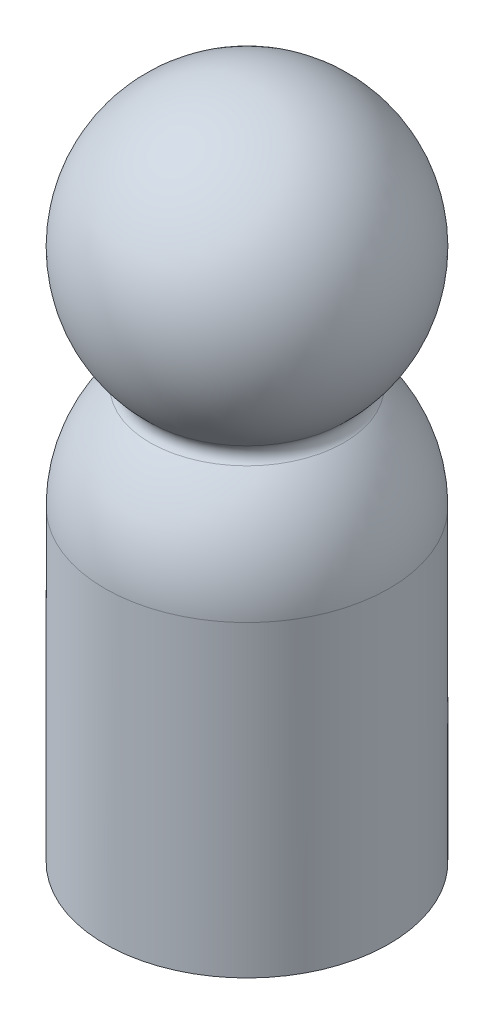
ISO-10303-21;
HEADER;
FILE_DESCRIPTION(('STEP AP214'),'2;1');
FILE_NAME('part.step','',(''),(''),'','','');
FILE_SCHEMA(('AUTOMOTIVE_DESIGN { 1 0 10303 214 1 1 1 1 }'));
ENDSEC;
DATA;
#1=APPLICATION_CONTEXT('core data for automotive mechanical design processes');
#2=APPLICATION_PROTOCOL_DEFINITION('international standard','automotive_design',2000,#1);
#3=PRODUCT_CONTEXT('',#1,'mechanical');
#4=PRODUCT('Part','Part','',(#3));
#5=PRODUCT_RELATED_PRODUCT_CATEGORY('part','',(#4));
#6=PRODUCT_DEFINITION_FORMATION('','',#4);
#7=PRODUCT_DEFINITION_CONTEXT('part definition',#1,'design');
#8=PRODUCT_DEFINITION('design','',#6,#7);
#9=PRODUCT_DEFINITION_SHAPE('','',#8);
#10=(LENGTH_UNIT() NAMED_UNIT(*) SI_UNIT(.MILLI.,.METRE.));
#11=(NAMED_UNIT(*) PLANE_ANGLE_UNIT() SI_UNIT($,.RADIAN.));
#12=(NAMED_UNIT(*) SI_UNIT($,.STERADIAN.) SOLID_ANGLE_UNIT());
#13=UNCERTAINTY_MEASURE_WITH_UNIT(LENGTH_MEASURE(1.E-05),#10,'distance_accuracy_value','');
#14=(GEOMETRIC_REPRESENTATION_CONTEXT(3) GLOBAL_UNCERTAINTY_ASSIGNED_CONTEXT((#13)) GLOBAL_UNIT_ASSIGNED_CONTEXT((#10,
#11,#12)) REPRESENTATION_CONTEXT('',''));
#15=CARTESIAN_POINT('',(0.,0.,0.));
#16=DIRECTION('',(0.,0.,1.));
#17=DIRECTION('',(1.,0.,0.));
#18=AXIS2_PLACEMENT_3D('',#15,#16,#17);
#19=CARTESIAN_POINT('',(0.,26.,0.));
#20=DIRECTION('',(0.,-1.,0.));
#21=DIRECTION('',(0.,0.,-1.));
#22=AXIS2_PLACEMENT_3D('',#19,#20,#21);
#23=CYLINDRICAL_SURFACE('',#22,12.);
#24=CARTESIAN_POINT('',(0.,26.,0.));
#25=DIRECTION('',(0.,1.,0.));
#26=DIRECTION('',(0.,0.,1.));
#27=AXIS2_PLACEMENT_3D('',#24,#25,#26);
#28=CIRCLE('',#27,12.);
#29=CARTESIAN_POINT('',(0.,26.,-12.));
#30=VERTEX_POINT('',#29);
#31=EDGE_CURVE('E52',#30,#30,#28,.T.);
#32=CARTESIAN_POINT('',(0.,0.,0.));
#33=DIRECTION('',(0.,1.,0.));
#34=DIRECTION('',(0.,0.,1.));
#35=AXIS2_PLACEMENT_3D('',#32,#33,#34);
#36=CIRCLE('',#35,12.);
#37=CARTESIAN_POINT('',(0.,0.,-12.));
#38=VERTEX_POINT('',#37);
#39=EDGE_CURVE('E57',#38,#38,#36,.T.);
#40=CARTESIAN_POINT('',(0.,26.,-12.));
#41=CARTESIAN_POINT('',(0.,25.7291666666667,-12.));
#42=CARTESIAN_POINT('',(0.,25.4583333333333,-12.));
#43=CARTESIAN_POINT('',(0.,24.9166666666667,-12.));
#44=CARTESIAN_POINT('',(0.,24.6458333333333,-12.));
#45=CARTESIAN_POINT('',(0.,24.1041666666667,-12.));
#46=CARTESIAN_POINT('',(0.,23.8333333333333,-12.));
#47=CARTESIAN_POINT('',(0.,23.2916666666667,-12.));
#48=CARTESIAN_POINT('',(0.,23.0208333333333,-12.));
#49=CARTESIAN_POINT('',(0.,22.4791666666667,-12.));
#50=CARTESIAN_POINT('',(0.,22.2083333333333,-12.));
#51=CARTESIAN_POINT('',(0.,21.6666666666667,-12.));
#52=CARTESIAN_POINT('',(0.,21.3958333333333,-12.));
#53=CARTESIAN_POINT('',(0.,20.8541666666667,-12.));
#54=CARTESIAN_POINT('',(0.,20.5833333333333,-12.));
#55=CARTESIAN_POINT('',(0.,20.0416666666667,-12.));
#56=CARTESIAN_POINT('',(0.,19.7708333333333,-12.));
#57=CARTESIAN_POINT('',(0.,19.2291666666667,-12.));
#58=CARTESIAN_POINT('',(0.,18.9583333333333,-12.));
#59=CARTESIAN_POINT('',(0.,18.4166666666667,-12.));
#60=CARTESIAN_POINT('',(0.,18.1458333333333,-12.));
#61=CARTESIAN_POINT('',(0.,17.6041666666667,-12.));
#62=CARTESIAN_POINT('',(0.,17.3333333333333,-12.));
#63=CARTESIAN_POINT('',(0.,16.7916666666667,-12.));
#64=CARTESIAN_POINT('',(0.,16.5208333333333,-12.));
#65=CARTESIAN_POINT('',(0.,15.9791666666667,-12.));
#66=CARTESIAN_POINT('',(0.,15.7083333333333,-12.));
#67=CARTESIAN_POINT('',(0.,15.1666666666667,-12.));
#68=CARTESIAN_POINT('',(0.,14.8958333333333,-12.));
#69=CARTESIAN_POINT('',(0.,14.3541666666667,-12.));
#70=CARTESIAN_POINT('',(0.,14.0833333333333,-12.));
#71=CARTESIAN_POINT('',(0.,13.5416666666667,-12.));
#72=CARTESIAN_POINT('',(0.,13.2708333333333,-12.));
#73=CARTESIAN_POINT('',(0.,12.7291666666667,-12.));
#74=CARTESIAN_POINT('',(0.,12.4583333333333,-12.));
#75=CARTESIAN_POINT('',(0.,11.9166666666667,-12.));
#76=CARTESIAN_POINT('',(0.,11.6458333333333,-12.));
#77=CARTESIAN_POINT('',(0.,11.1041666666667,-12.));
#78=CARTESIAN_POINT('',(0.,10.8333333333333,-12.));
#79=CARTESIAN_POINT('',(0.,10.2916666666667,-12.));
#80=CARTESIAN_POINT('',(0.,10.0208333333333,-12.));
#81=CARTESIAN_POINT('',(0.,9.47916666666667,-12.));
#82=CARTESIAN_POINT('',(0.,9.20833333333333,-12.));
#83=CARTESIAN_POINT('',(0.,8.66666666666667,-12.));
#84=CARTESIAN_POINT('',(0.,8.39583333333333,-12.));
#85=CARTESIAN_POINT('',(0.,7.85416666666667,-12.));
#86=CARTESIAN_POINT('',(0.,7.58333333333333,-12.));
#87=CARTESIAN_POINT('',(0.,7.04166666666667,-12.));
#88=CARTESIAN_POINT('',(0.,6.77083333333333,-12.));
#89=CARTESIAN_POINT('',(0.,6.22916666666667,-12.));
#90=CARTESIAN_POINT('',(0.,5.95833333333333,-12.));
#91=CARTESIAN_POINT('',(0.,5.41666666666667,-12.));
#92=CARTESIAN_POINT('',(0.,5.14583333333333,-12.));
#93=CARTESIAN_POINT('',(0.,4.60416666666667,-12.));
#94=CARTESIAN_POINT('',(0.,4.33333333333333,-12.));
#95=CARTESIAN_POINT('',(0.,3.79166666666667,-12.));
#96=CARTESIAN_POINT('',(0.,3.52083333333333,-12.));
#97=CARTESIAN_POINT('',(0.,2.97916666666667,-12.));
#98=CARTESIAN_POINT('',(0.,2.70833333333333,-12.));
#99=CARTESIAN_POINT('',(0.,2.16666666666667,-12.));
#100=CARTESIAN_POINT('',(0.,1.89583333333333,-12.));
#101=CARTESIAN_POINT('',(0.,1.35416666666667,-12.));
#102=CARTESIAN_POINT('',(0.,1.08333333333333,-12.));
#103=CARTESIAN_POINT('',(0.,0.541666666666667,-12.));
#104=CARTESIAN_POINT('',(0.,0.270833333333334,-12.));
#105=CARTESIAN_POINT('',(0.,0.,-12.));
#106=B_SPLINE_CURVE_WITH_KNOTS('',3,(#40,#41,#42,#43,#44,#45,#46,#47,#48,#49,#50,#51,#52,#53,
#54,#55,#56,#57,#58,#59,#60,#61,#62,#63,#64,#65,#66,#67,#68,#69,#70,#71,#72,#73,#74,#75,#76,#77,
#78,#79,#80,#81,#82,#83,#84,#85,#86,#87,#88,#89,#90,#91,#92,#93,#94,#95,#96,#97,#98,#99,#100,
#101,#102,#103,#104,#105),.UNSPECIFIED.,.F.,.F.,(4,2,2,2,2,2,2,2,2,2,2,2,2,2,2,2,2,2,2,2,2,2,2,
2,2,2,2,2,2,2,2,2,4),(0.,0.812500000000001,1.625,2.4375,3.25,4.0625,4.875,5.6875,6.5,7.3125,
8.125,8.9375,9.75,10.5625,11.375,12.1875,13.,13.8125,14.625,15.4375,16.25,17.0625,17.875,
18.6875,19.5,20.3125,21.125,21.9375,22.75,23.5625,24.375,25.1875,26.),.UNSPECIFIED.);
#107=EDGE_CURVE('BSEAM39',#30,#38,#106,.T.);
#108=ORIENTED_EDGE('',*,*,#31,.F.);
#109=ORIENTED_EDGE('',*,*,#39,.T.);
#110=ORIENTED_EDGE('',*,*,#107,.T.);
#111=ORIENTED_EDGE('',*,*,#107,.F.);
#112=EDGE_LOOP('',(#108,#110,#109,#111));
#113=FACE_BOUND('',#112,.T.);
#114=ADVANCED_FACE('F39',(#113),#23,.T.);
#115=CARTESIAN_POINT('',(0.,0.,0.));
#116=DIRECTION('',(0.,1.,0.));
#117=DIRECTION('',(0.,0.,1.));
#118=AXIS2_PLACEMENT_3D('',#115,#116,#117);
#119=PLANE('',#118);
#120=ORIENTED_EDGE('',*,*,#39,.F.);
#121=EDGE_LOOP('',(#120));
#122=FACE_BOUND('',#121,.T.);
#123=ADVANCED_FACE('F65',(#122),#119,.F.);
#124=CARTESIAN_POINT('',(0.,26.,0.));
#125=DIRECTION('',(0.,1.,0.));
#126=DIRECTION('',(1.,0.,0.));
#127=AXIS2_PLACEMENT_3D('',#124,#125,#126);
#128=SPHERICAL_SURFACE('',#127,12.);
#129=CARTESIAN_POINT('',(0.,34.7692307692308,0.));
#130=DIRECTION('',(0.,-1.,0.));
#131=DIRECTION('',(1.,0.,0.));
#132=AXIS2_PLACEMENT_3D('',#129,#130,#131);
#133=CIRCLE('',#132,8.19149508429178);
#134=CARTESIAN_POINT('',(8.19149508429178,34.7692307692308,0.));
#135=VERTEX_POINT('',#134);
#136=EDGE_CURVE('E10',#135,#135,#133,.T.);
#137=ORIENTED_EDGE('',*,*,#136,.T.);
#138=EDGE_LOOP('',(#137));
#139=FACE_BOUND('',#138,.T.);
#140=ORIENTED_EDGE('',*,*,#31,.T.);
#141=EDGE_LOOP('',(#140));
#142=FACE_BOUND('',#141,.T.);
#143=ADVANCED_FACE('F67',(#139,#142),#128,.T.);
#144=CARTESIAN_POINT('',(0.,45.,0.));
#145=DIRECTION('',(0.,1.,0.));
#146=DIRECTION('',(1.,0.,0.));
#147=AXIS2_PLACEMENT_3D('',#144,#145,#146);
#148=SPHERICAL_SURFACE('',#147,12.);
#149=CARTESIAN_POINT('',(0.,36.2307692307692,0.));
#150=DIRECTION('',(0.,1.,0.));
#151=DIRECTION('',(-1.,0.,0.));
#152=AXIS2_PLACEMENT_3D('',#149,#150,#151);
#153=CIRCLE('',#152,8.19149508429177);
#154=CARTESIAN_POINT('',(-8.19149508429177,36.2307692307692,0.));
#155=VERTEX_POINT('',#154);
#156=EDGE_CURVE('E47',#155,#155,#153,.T.);
#157=ORIENTED_EDGE('',*,*,#156,.T.);
#158=EDGE_LOOP('',(#157));
#159=FACE_BOUND('',#158,.T.);
#160=ADVANCED_FACE('F73',(#159),#148,.T.);
#161=CARTESIAN_POINT('',(0.,35.5,0.));
#162=DIRECTION('',(0.,-1.,0.));
#163=DIRECTION('',(1.,0.,0.));
#164=AXIS2_PLACEMENT_3D('',#161,#162,#163);
#165=TOROIDAL_SURFACE('',#164,8.87411967464942,1.);
#166=ORIENTED_EDGE('',*,*,#136,.F.);
#167=EDGE_LOOP('',(#166));
#168=FACE_BOUND('',#167,.T.);
#169=ORIENTED_EDGE('',*,*,#156,.F.);
#170=EDGE_LOOP('',(#169));
#171=FACE_BOUND('',#170,.T.);
#172=ADVANCED_FACE('F41',(#168,#171),#165,.F.);
#173=CLOSED_SHELL('',(#114,#123,#143,#160,#172));
#174=MANIFOLD_SOLID_BREP('B2',#173);
#175=ADVANCED_BREP_SHAPE_REPRESENTATION('',(#18,#174),#14);
#176=SHAPE_DEFINITION_REPRESENTATION(#9,#175);
ENDSEC;
END-ISO-10303-21;
